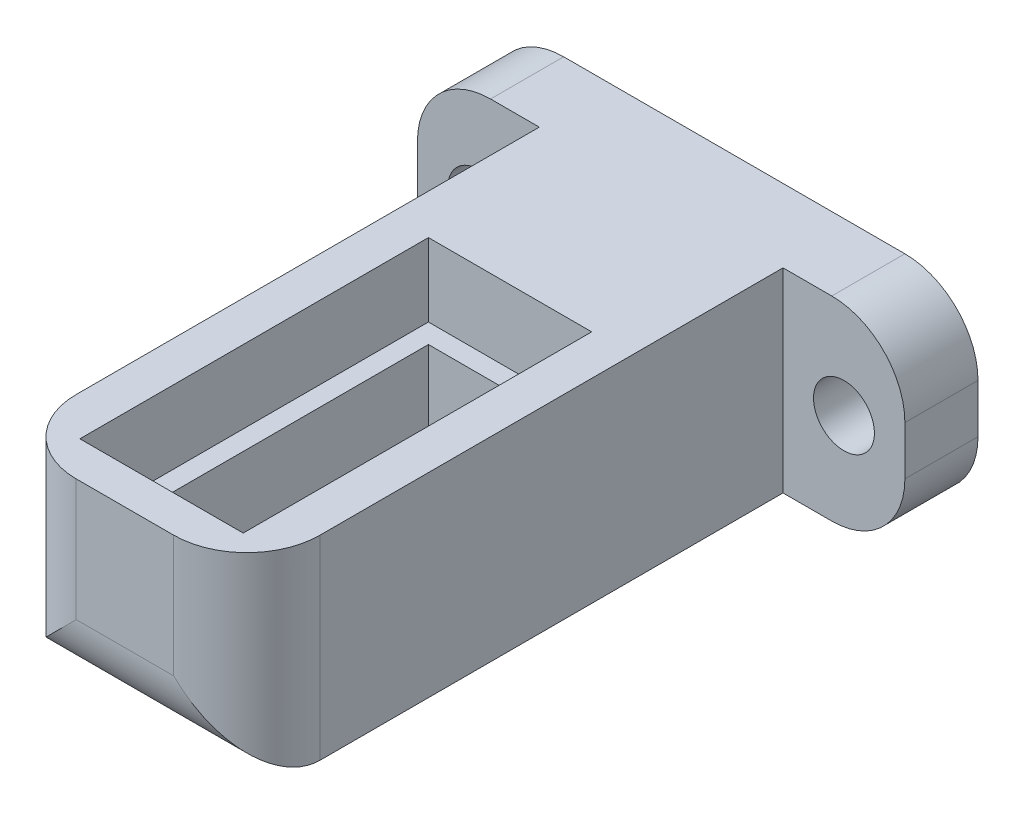
ISO-10303-21;
HEADER;
FILE_DESCRIPTION(('STEP AP214'),'2;1');
FILE_NAME('part.step','',(''),(''),'','','');
FILE_SCHEMA(('AUTOMOTIVE_DESIGN { 1 0 10303 214 1 1 1 1 }'));
ENDSEC;
DATA;
#1=APPLICATION_CONTEXT('core data for automotive mechanical design processes');
#2=APPLICATION_PROTOCOL_DEFINITION('international standard','automotive_design',2000,#1);
#3=PRODUCT_CONTEXT('',#1,'mechanical');
#4=PRODUCT('Part','Part','',(#3));
#5=PRODUCT_RELATED_PRODUCT_CATEGORY('part','',(#4));
#6=PRODUCT_DEFINITION_FORMATION('','',#4);
#7=PRODUCT_DEFINITION_CONTEXT('part definition',#1,'design');
#8=PRODUCT_DEFINITION('design','',#6,#7);
#9=PRODUCT_DEFINITION_SHAPE('','',#8);
#10=(LENGTH_UNIT() NAMED_UNIT(*) SI_UNIT(.MILLI.,.METRE.));
#11=(NAMED_UNIT(*) PLANE_ANGLE_UNIT() SI_UNIT($,.RADIAN.));
#12=(NAMED_UNIT(*) SI_UNIT($,.STERADIAN.) SOLID_ANGLE_UNIT());
#13=UNCERTAINTY_MEASURE_WITH_UNIT(LENGTH_MEASURE(1.E-05),#10,'distance_accuracy_value','');
#14=(GEOMETRIC_REPRESENTATION_CONTEXT(3) GLOBAL_UNCERTAINTY_ASSIGNED_CONTEXT((#13)) GLOBAL_UNIT_ASSIGNED_CONTEXT((#10,
#11,#12)) REPRESENTATION_CONTEXT('',''));
#15=CARTESIAN_POINT('',(0.,0.,0.));
#16=DIRECTION('',(0.,0.,1.));
#17=DIRECTION('',(1.,0.,0.));
#18=AXIS2_PLACEMENT_3D('',#15,#16,#17);
#19=CARTESIAN_POINT('',(-5.,8.,12.5));
#20=DIRECTION('',(1.,0.,0.));
#21=DIRECTION('',(0.,0.,-1.));
#22=AXIS2_PLACEMENT_3D('',#19,#20,#21);
#23=PLANE('',#22);
#24=DIRECTION('',(0.,0.,1.));
#25=VECTOR('',#24,1.);
#26=CARTESIAN_POINT('',(-5.,0.,12.5));
#27=LINE('',#26,#25);
#28=CARTESIAN_POINT('',(-5.,0.,-9.5));
#29=VERTEX_POINT('',#28);
#30=CARTESIAN_POINT('',(-5.,0.,9.5));
#31=VERTEX_POINT('',#30);
#32=EDGE_CURVE('E356',#29,#31,#27,.T.);
#33=ORIENTED_EDGE('',*,*,#32,.T.);
#34=DIRECTION('',(0.,-1.,0.));
#35=VECTOR('',#34,1.);
#36=CARTESIAN_POINT('',(-5.,8.,9.5));
#37=LINE('',#36,#35);
#38=CARTESIAN_POINT('',(-5.,8.,9.5));
#39=VERTEX_POINT('',#38);
#40=EDGE_CURVE('E53',#31,#39,#37,.F.);
#41=ORIENTED_EDGE('',*,*,#40,.T.);
#42=DIRECTION('',(0.,0.,1.));
#43=VECTOR('',#42,1.);
#44=CARTESIAN_POINT('',(-5.,8.,12.5));
#45=LINE('',#44,#43);
#46=CARTESIAN_POINT('',(-5.,8.,-9.5));
#47=VERTEX_POINT('',#46);
#48=EDGE_CURVE('E360',#47,#39,#45,.T.);
#49=ORIENTED_EDGE('',*,*,#48,.F.);
#50=DIRECTION('',(0.,1.,0.));
#51=VECTOR('',#50,1.);
#52=CARTESIAN_POINT('',(-5.,8.,-9.5));
#53=LINE('',#52,#51);
#54=EDGE_CURVE('E261',#29,#47,#53,.T.);
#55=ORIENTED_EDGE('',*,*,#54,.F.);
#56=EDGE_LOOP('',(#33,#41,#49,#55));
#57=FACE_BOUND('',#56,.T.);
#58=ADVANCED_FACE('F43',(#57),#23,.F.);
#59=CARTESIAN_POINT('',(5.,8.,12.5));
#60=DIRECTION('',(-1.,0.,0.));
#61=DIRECTION('',(0.,0.,1.));
#62=AXIS2_PLACEMENT_3D('',#59,#60,#61);
#63=PLANE('',#62);
#64=DIRECTION('',(0.,0.,-1.));
#65=VECTOR('',#64,1.);
#66=CARTESIAN_POINT('',(5.,8.,12.5));
#67=LINE('',#66,#65);
#68=CARTESIAN_POINT('',(5.,8.,9.5));
#69=VERTEX_POINT('',#68);
#70=CARTESIAN_POINT('',(5.,8.,-9.5));
#71=VERTEX_POINT('',#70);
#72=EDGE_CURVE('E352',#69,#71,#67,.T.);
#73=ORIENTED_EDGE('',*,*,#72,.F.);
#74=DIRECTION('',(0.,-1.,0.));
#75=VECTOR('',#74,1.);
#76=CARTESIAN_POINT('',(5.,8.,9.5));
#77=LINE('',#76,#75);
#78=CARTESIAN_POINT('',(5.,0.,9.5));
#79=VERTEX_POINT('',#78);
#80=EDGE_CURVE('E427',#69,#79,#77,.T.);
#81=ORIENTED_EDGE('',*,*,#80,.T.);
#82=DIRECTION('',(0.,0.,-1.));
#83=VECTOR('',#82,1.);
#84=CARTESIAN_POINT('',(5.,0.,12.5));
#85=LINE('',#84,#83);
#86=CARTESIAN_POINT('',(5.,0.,-9.5));
#87=VERTEX_POINT('',#86);
#88=EDGE_CURVE('E342',#79,#87,#85,.T.);
#89=ORIENTED_EDGE('',*,*,#88,.T.);
#90=DIRECTION('',(0.,1.,0.));
#91=VECTOR('',#90,1.);
#92=CARTESIAN_POINT('',(5.,8.,-9.5));
#93=LINE('',#92,#91);
#94=EDGE_CURVE('E288',#87,#71,#93,.T.);
#95=ORIENTED_EDGE('',*,*,#94,.T.);
#96=EDGE_LOOP('',(#73,#81,#89,#95));
#97=FACE_BOUND('',#96,.T.);
#98=ADVANCED_FACE('F480',(#97),#63,.F.);
#99=CARTESIAN_POINT('',(-5.,8.,-12.5));
#100=DIRECTION('',(0.,0.,1.));
#101=DIRECTION('',(1.,0.,0.));
#102=AXIS2_PLACEMENT_3D('',#99,#100,#101);
#103=PLANE('',#102);
#104=CARTESIAN_POINT('',(-7.5,4.,-12.5));
#105=DIRECTION('',(0.,0.,-1.));
#106=DIRECTION('',(-1.,0.,0.));
#107=AXIS2_PLACEMENT_3D('',#104,#105,#106);
#108=CIRCLE('',#107,1.25);
#109=CARTESIAN_POINT('',(-8.75,4.,-12.5));
#110=VERTEX_POINT('',#109);
#111=EDGE_CURVE('E253',#110,#110,#108,.T.);
#112=ORIENTED_EDGE('',*,*,#111,.F.);
#113=EDGE_LOOP('',(#112));
#114=FACE_BOUND('',#113,.T.);
#115=CARTESIAN_POINT('',(7.5,4.,-12.5));
#116=DIRECTION('',(0.,0.,1.));
#117=DIRECTION('',(1.,0.,0.));
#118=AXIS2_PLACEMENT_3D('',#115,#116,#117);
#119=CIRCLE('',#118,1.25);
#120=CARTESIAN_POINT('',(8.75,4.,-12.5));
#121=VERTEX_POINT('',#120);
#122=EDGE_CURVE('E280',#121,#121,#119,.T.);
#123=ORIENTED_EDGE('',*,*,#122,.T.);
#124=EDGE_LOOP('',(#123));
#125=FACE_BOUND('',#124,.T.);
#126=DIRECTION('',(-1.,0.,0.));
#127=VECTOR('',#126,1.);
#128=CARTESIAN_POINT('',(-5.,0.,-12.5));
#129=LINE('',#128,#127);
#130=CARTESIAN_POINT('',(7.,0.,-12.5));
#131=VERTEX_POINT('',#130);
#132=CARTESIAN_POINT('',(-7.,0.,-12.5));
#133=VERTEX_POINT('',#132);
#134=EDGE_CURVE('E370',#131,#133,#129,.T.);
#135=ORIENTED_EDGE('',*,*,#134,.T.);
#136=CARTESIAN_POINT('',(-7.,3.,-12.5));
#137=DIRECTION('',(0.,0.,1.));
#138=DIRECTION('',(1.,0.,0.));
#139=AXIS2_PLACEMENT_3D('',#136,#137,#138);
#140=CIRCLE('',#139,3.);
#141=CARTESIAN_POINT('',(-10.,3.,-12.5));
#142=VERTEX_POINT('',#141);
#143=EDGE_CURVE('E408',#133,#142,#140,.F.);
#144=ORIENTED_EDGE('',*,*,#143,.T.);
#145=DIRECTION('',(0.,-1.,0.));
#146=VECTOR('',#145,1.);
#147=CARTESIAN_POINT('',(-10.,8.,-12.5));
#148=LINE('',#147,#146);
#149=CARTESIAN_POINT('',(-10.,5.,-12.5));
#150=VERTEX_POINT('',#149);
#151=EDGE_CURVE('E257',#150,#142,#148,.T.);
#152=ORIENTED_EDGE('',*,*,#151,.F.);
#153=CARTESIAN_POINT('',(-7.,5.,-12.5));
#154=DIRECTION('',(0.,0.,1.));
#155=DIRECTION('',(1.,0.,0.));
#156=AXIS2_PLACEMENT_3D('',#153,#154,#155);
#157=CIRCLE('',#156,3.);
#158=CARTESIAN_POINT('',(-7.,8.,-12.5));
#159=VERTEX_POINT('',#158);
#160=EDGE_CURVE('E405',#150,#159,#157,.F.);
#161=ORIENTED_EDGE('',*,*,#160,.T.);
#162=DIRECTION('',(-1.,0.,0.));
#163=VECTOR('',#162,1.);
#164=CARTESIAN_POINT('',(-5.,8.,-12.5));
#165=LINE('',#164,#163);
#166=CARTESIAN_POINT('',(7.,8.,-12.5));
#167=VERTEX_POINT('',#166);
#168=EDGE_CURVE('E355',#167,#159,#165,.T.);
#169=ORIENTED_EDGE('',*,*,#168,.F.);
#170=CARTESIAN_POINT('',(7.,5.,-12.5));
#171=DIRECTION('',(0.,0.,1.));
#172=DIRECTION('',(1.,0.,0.));
#173=AXIS2_PLACEMENT_3D('',#170,#171,#172);
#174=CIRCLE('',#173,3.);
#175=CARTESIAN_POINT('',(10.,5.,-12.5));
#176=VERTEX_POINT('',#175);
#177=EDGE_CURVE('E382',#167,#176,#174,.F.);
#178=ORIENTED_EDGE('',*,*,#177,.T.);
#179=DIRECTION('',(0.,-1.,0.));
#180=VECTOR('',#179,1.);
#181=CARTESIAN_POINT('',(10.,8.,-12.5));
#182=LINE('',#181,#180);
#183=CARTESIAN_POINT('',(10.,3.,-12.5));
#184=VERTEX_POINT('',#183);
#185=EDGE_CURVE('E284',#176,#184,#182,.T.);
#186=ORIENTED_EDGE('',*,*,#185,.T.);
#187=CARTESIAN_POINT('',(7.,3.,-12.5));
#188=DIRECTION('',(0.,0.,1.));
#189=DIRECTION('',(1.,0.,0.));
#190=AXIS2_PLACEMENT_3D('',#187,#188,#189);
#191=CIRCLE('',#190,3.);
#192=EDGE_CURVE('E385',#184,#131,#191,.F.);
#193=ORIENTED_EDGE('',*,*,#192,.T.);
#194=EDGE_LOOP('',(#135,#144,#152,#161,#169,#178,#186,#193));
#195=FACE_BOUND('',#194,.T.);
#196=ADVANCED_FACE('F485',(#114,#125,#195),#103,.F.);
#197=CARTESIAN_POINT('',(-5.,8.,12.5));
#198=DIRECTION('',(0.,0.,-1.));
#199=DIRECTION('',(-1.,0.,0.));
#200=AXIS2_PLACEMENT_3D('',#197,#198,#199);
#201=PLANE('',#200);
#202=DIRECTION('',(1.,0.,0.));
#203=VECTOR('',#202,1.);
#204=CARTESIAN_POINT('',(5.,3.,12.5));
#205=LINE('',#204,#203);
#206=CARTESIAN_POINT('',(-2.,3.,12.5));
#207=VERTEX_POINT('',#206);
#208=CARTESIAN_POINT('',(2.,3.,12.5));
#209=VERTEX_POINT('',#208);
#210=EDGE_CURVE('E431',#207,#209,#205,.T.);
#211=ORIENTED_EDGE('',*,*,#210,.T.);
#212=DIRECTION('',(0.,-1.,0.));
#213=VECTOR('',#212,1.);
#214=CARTESIAN_POINT('',(2.,8.,12.5));
#215=LINE('',#214,#213);
#216=CARTESIAN_POINT('',(2.,8.,12.5));
#217=VERTEX_POINT('',#216);
#218=EDGE_CURVE('E437',#209,#217,#215,.F.);
#219=ORIENTED_EDGE('',*,*,#218,.T.);
#220=DIRECTION('',(1.,0.,0.));
#221=VECTOR('',#220,1.);
#222=CARTESIAN_POINT('',(-5.,8.,12.5));
#223=LINE('',#222,#221);
#224=CARTESIAN_POINT('',(-2.,8.,12.5));
#225=VERTEX_POINT('',#224);
#226=EDGE_CURVE('E363',#225,#217,#223,.T.);
#227=ORIENTED_EDGE('',*,*,#226,.F.);
#228=DIRECTION('',(0.,-1.,0.));
#229=VECTOR('',#228,1.);
#230=CARTESIAN_POINT('',(-2.,8.,12.5));
#231=LINE('',#230,#229);
#232=EDGE_CURVE('E434',#225,#207,#231,.T.);
#233=ORIENTED_EDGE('',*,*,#232,.T.);
#234=EDGE_LOOP('',(#211,#219,#227,#233));
#235=FACE_BOUND('',#234,.T.);
#236=ADVANCED_FACE('F490',(#235),#201,.F.);
#237=CARTESIAN_POINT('',(0.,8.,0.));
#238=DIRECTION('',(0.,-1.,0.));
#239=DIRECTION('',(0.,0.,-1.));
#240=AXIS2_PLACEMENT_3D('',#237,#238,#239);
#241=PLANE('',#240);
#242=DIRECTION('',(1.,0.,0.));
#243=VECTOR('',#242,1.);
#244=CARTESIAN_POINT('',(-3.35,8.,11.));
#245=LINE('',#244,#243);
#246=CARTESIAN_POINT('',(-3.35,8.,11.));
#247=VERTEX_POINT('',#246);
#248=CARTESIAN_POINT('',(3.35,8.,11.));
#249=VERTEX_POINT('',#248);
#250=EDGE_CURVE('E328',#247,#249,#245,.T.);
#251=ORIENTED_EDGE('',*,*,#250,.F.);
#252=DIRECTION('',(0.,0.,1.));
#253=VECTOR('',#252,1.);
#254=CARTESIAN_POINT('',(-3.35,8.,-3.3));
#255=LINE('',#254,#253);
#256=CARTESIAN_POINT('',(-3.35,8.,-3.3));
#257=VERTEX_POINT('',#256);
#258=EDGE_CURVE('E304',#257,#247,#255,.T.);
#259=ORIENTED_EDGE('',*,*,#258,.F.);
#260=DIRECTION('',(-1.,0.,0.));
#261=VECTOR('',#260,1.);
#262=CARTESIAN_POINT('',(-3.35,8.,-3.3));
#263=LINE('',#262,#261);
#264=CARTESIAN_POINT('',(3.35,8.,-3.3));
#265=VERTEX_POINT('',#264);
#266=EDGE_CURVE('E313',#265,#257,#263,.T.);
#267=ORIENTED_EDGE('',*,*,#266,.F.);
#268=DIRECTION('',(0.,0.,-1.));
#269=VECTOR('',#268,1.);
#270=CARTESIAN_POINT('',(3.35,8.,-3.3));
#271=LINE('',#270,#269);
#272=EDGE_CURVE('E332',#249,#265,#271,.T.);
#273=ORIENTED_EDGE('',*,*,#272,.F.);
#274=EDGE_LOOP('',(#251,#259,#267,#273));
#275=FACE_BOUND('',#274,.T.);
#276=ORIENTED_EDGE('',*,*,#226,.T.);
#277=CARTESIAN_POINT('',(2.,8.,9.5));
#278=DIRECTION('',(0.,-1.,0.));
#279=DIRECTION('',(0.,0.,-1.));
#280=AXIS2_PLACEMENT_3D('',#277,#278,#279);
#281=CIRCLE('',#280,3.);
#282=EDGE_CURVE('E443',#217,#69,#281,.F.);
#283=ORIENTED_EDGE('',*,*,#282,.T.);
#284=ORIENTED_EDGE('',*,*,#72,.T.);
#285=DIRECTION('',(1.,0.,0.));
#286=VECTOR('',#285,1.);
#287=CARTESIAN_POINT('',(5.,8.,-9.5));
#288=LINE('',#287,#286);
#289=CARTESIAN_POINT('',(7.,8.,-9.5));
#290=VERTEX_POINT('',#289);
#291=EDGE_CURVE('E292',#71,#290,#288,.T.);
#292=ORIENTED_EDGE('',*,*,#291,.T.);
#293=DIRECTION('',(0.,0.,-1.));
#294=VECTOR('',#293,1.);
#295=CARTESIAN_POINT('',(7.,8.,-12.5));
#296=LINE('',#295,#294);
#297=EDGE_CURVE('E397',#290,#167,#296,.T.);
#298=ORIENTED_EDGE('',*,*,#297,.T.);
#299=ORIENTED_EDGE('',*,*,#168,.T.);
#300=DIRECTION('',(0.,0.,-1.));
#301=VECTOR('',#300,1.);
#302=CARTESIAN_POINT('',(-7.,8.,0.));
#303=LINE('',#302,#301);
#304=CARTESIAN_POINT('',(-7.,8.,-9.5));
#305=VERTEX_POINT('',#304);
#306=EDGE_CURVE('E424',#159,#305,#303,.F.);
#307=ORIENTED_EDGE('',*,*,#306,.T.);
#308=DIRECTION('',(-1.,0.,0.));
#309=VECTOR('',#308,1.);
#310=CARTESIAN_POINT('',(-5.,8.,-9.5));
#311=LINE('',#310,#309);
#312=EDGE_CURVE('E272',#47,#305,#311,.T.);
#313=ORIENTED_EDGE('',*,*,#312,.F.);
#314=ORIENTED_EDGE('',*,*,#48,.T.);
#315=CARTESIAN_POINT('',(-2.,8.,9.5));
#316=DIRECTION('',(0.,-1.,0.));
#317=DIRECTION('',(0.,0.,-1.));
#318=AXIS2_PLACEMENT_3D('',#315,#316,#317);
#319=CIRCLE('',#318,3.);
#320=EDGE_CURVE('E440',#39,#225,#319,.F.);
#321=ORIENTED_EDGE('',*,*,#320,.T.);
#322=EDGE_LOOP('',(#276,#283,#284,#292,#298,#299,#307,#313,#314,#321));
#323=FACE_BOUND('',#322,.T.);
#324=ADVANCED_FACE('F650',(#275,#323),#241,.F.);
#325=CARTESIAN_POINT('',(0.,0.,0.));
#326=DIRECTION('',(0.,-1.,0.));
#327=DIRECTION('',(0.,0.,-1.));
#328=AXIS2_PLACEMENT_3D('',#325,#326,#327);
#329=PLANE('',#328);
#330=CARTESIAN_POINT('',(0.,0.,0.499999999999998));
#331=DIRECTION('',(0.,1.,0.));
#332=DIRECTION('',(0.,0.,1.));
#333=AXIS2_PLACEMENT_3D('',#330,#331,#332);
#334=CIRCLE('',#333,2.);
#335=CARTESIAN_POINT('',(0.,0.,2.5));
#336=VERTEX_POINT('',#335);
#337=EDGE_CURVE('E238',#336,#336,#334,.T.);
#338=ORIENTED_EDGE('',*,*,#337,.T.);
#339=EDGE_LOOP('',(#338));
#340=FACE_BOUND('',#339,.T.);
#341=ORIENTED_EDGE('',*,*,#88,.F.);
#342=DIRECTION('',(1.,0.,0.));
#343=VECTOR('',#342,1.);
#344=CARTESIAN_POINT('',(-5.,0.,9.5));
#345=LINE('',#344,#343);
#346=EDGE_CURVE('E11',#79,#31,#345,.F.);
#347=ORIENTED_EDGE('',*,*,#346,.T.);
#348=ORIENTED_EDGE('',*,*,#32,.F.);
#349=DIRECTION('',(1.,0.,0.));
#350=VECTOR('',#349,1.);
#351=CARTESIAN_POINT('',(-5.,0.,-9.5));
#352=LINE('',#351,#350);
#353=CARTESIAN_POINT('',(-7.,0.,-9.5));
#354=VERTEX_POINT('',#353);
#355=EDGE_CURVE('E265',#354,#29,#352,.T.);
#356=ORIENTED_EDGE('',*,*,#355,.F.);
#357=DIRECTION('',(0.,0.,-1.));
#358=VECTOR('',#357,1.);
#359=CARTESIAN_POINT('',(-7.,0.,-12.5));
#360=LINE('',#359,#358);
#361=EDGE_CURVE('E401',#354,#133,#360,.T.);
#362=ORIENTED_EDGE('',*,*,#361,.T.);
#363=ORIENTED_EDGE('',*,*,#134,.F.);
#364=DIRECTION('',(0.,0.,-1.));
#365=VECTOR('',#364,1.);
#366=CARTESIAN_POINT('',(7.,0.,0.));
#367=LINE('',#366,#365);
#368=CARTESIAN_POINT('',(7.,0.,-9.5));
#369=VERTEX_POINT('',#368);
#370=EDGE_CURVE('E388',#131,#369,#367,.F.);
#371=ORIENTED_EDGE('',*,*,#370,.T.);
#372=DIRECTION('',(-1.,0.,0.));
#373=VECTOR('',#372,1.);
#374=CARTESIAN_POINT('',(5.,0.,-9.5));
#375=LINE('',#374,#373);
#376=EDGE_CURVE('E300',#369,#87,#375,.T.);
#377=ORIENTED_EDGE('',*,*,#376,.T.);
#378=EDGE_LOOP('',(#341,#347,#348,#356,#362,#363,#371,#377));
#379=FACE_BOUND('',#378,.T.);
#380=ADVANCED_FACE('F466',(#340,#379),#329,.T.);
#381=CARTESIAN_POINT('',(-3.35,5.,-3.3));
#382=DIRECTION('',(-1.,0.,0.));
#383=DIRECTION('',(0.,0.,1.));
#384=AXIS2_PLACEMENT_3D('',#381,#382,#383);
#385=PLANE('',#384);
#386=ORIENTED_EDGE('',*,*,#258,.T.);
#387=DIRECTION('',(0.,1.,0.));
#388=VECTOR('',#387,1.);
#389=CARTESIAN_POINT('',(-3.35,5.,11.));
#390=LINE('',#389,#388);
#391=CARTESIAN_POINT('',(-3.35,5.,11.));
#392=VERTEX_POINT('',#391);
#393=EDGE_CURVE('E325',#392,#247,#390,.T.);
#394=ORIENTED_EDGE('',*,*,#393,.F.);
#395=DIRECTION('',(0.,0.,1.));
#396=VECTOR('',#395,1.);
#397=CARTESIAN_POINT('',(-3.35,5.,-3.3));
#398=LINE('',#397,#396);
#399=CARTESIAN_POINT('',(-3.35,5.,-3.3));
#400=VERTEX_POINT('',#399);
#401=EDGE_CURVE('E308',#400,#392,#398,.T.);
#402=ORIENTED_EDGE('',*,*,#401,.F.);
#403=DIRECTION('',(0.,1.,0.));
#404=VECTOR('',#403,1.);
#405=CARTESIAN_POINT('',(-3.35,5.,-3.3));
#406=LINE('',#405,#404);
#407=EDGE_CURVE('E339',#400,#257,#406,.T.);
#408=ORIENTED_EDGE('',*,*,#407,.T.);
#409=EDGE_LOOP('',(#386,#394,#402,#408));
#410=FACE_BOUND('',#409,.T.);
#411=ADVANCED_FACE('F649',(#410),#385,.F.);
#412=CARTESIAN_POINT('',(-3.35,5.,-3.3));
#413=DIRECTION('',(0.,0.,-1.));
#414=DIRECTION('',(-1.,0.,0.));
#415=AXIS2_PLACEMENT_3D('',#412,#413,#414);
#416=PLANE('',#415);
#417=ORIENTED_EDGE('',*,*,#266,.T.);
#418=ORIENTED_EDGE('',*,*,#407,.F.);
#419=DIRECTION('',(-1.,0.,0.));
#420=VECTOR('',#419,1.);
#421=CARTESIAN_POINT('',(-3.35,5.,-3.3));
#422=LINE('',#421,#420);
#423=CARTESIAN_POINT('',(3.35,5.,-3.3));
#424=VERTEX_POINT('',#423);
#425=EDGE_CURVE('E321',#424,#400,#422,.T.);
#426=ORIENTED_EDGE('',*,*,#425,.F.);
#427=DIRECTION('',(0.,1.,0.));
#428=VECTOR('',#427,1.);
#429=CARTESIAN_POINT('',(3.35,5.,-3.3));
#430=LINE('',#429,#428);
#431=EDGE_CURVE('E343',#424,#265,#430,.T.);
#432=ORIENTED_EDGE('',*,*,#431,.T.);
#433=EDGE_LOOP('',(#417,#418,#426,#432));
#434=FACE_BOUND('',#433,.T.);
#435=ADVANCED_FACE('F761',(#434),#416,.F.);
#436=CARTESIAN_POINT('',(3.35,5.,-3.3));
#437=DIRECTION('',(1.,0.,0.));
#438=DIRECTION('',(0.,0.,-1.));
#439=AXIS2_PLACEMENT_3D('',#436,#437,#438);
#440=PLANE('',#439);
#441=ORIENTED_EDGE('',*,*,#272,.T.);
#442=ORIENTED_EDGE('',*,*,#431,.F.);
#443=DIRECTION('',(0.,0.,-1.));
#444=VECTOR('',#443,1.);
#445=CARTESIAN_POINT('',(3.35,5.,-3.3));
#446=LINE('',#445,#444);
#447=CARTESIAN_POINT('',(3.35,5.,11.));
#448=VERTEX_POINT('',#447);
#449=EDGE_CURVE('E317',#448,#424,#446,.T.);
#450=ORIENTED_EDGE('',*,*,#449,.F.);
#451=DIRECTION('',(0.,1.,0.));
#452=VECTOR('',#451,1.);
#453=CARTESIAN_POINT('',(3.35,5.,11.));
#454=LINE('',#453,#452);
#455=EDGE_CURVE('E346',#448,#249,#454,.T.);
#456=ORIENTED_EDGE('',*,*,#455,.T.);
#457=EDGE_LOOP('',(#441,#442,#450,#456));
#458=FACE_BOUND('',#457,.T.);
#459=ADVANCED_FACE('F753',(#458),#440,.F.);
#460=CARTESIAN_POINT('',(-3.35,5.,11.));
#461=DIRECTION('',(0.,0.,1.));
#462=DIRECTION('',(1.,0.,0.));
#463=AXIS2_PLACEMENT_3D('',#460,#461,#462);
#464=PLANE('',#463);
#465=ORIENTED_EDGE('',*,*,#250,.T.);
#466=ORIENTED_EDGE('',*,*,#455,.F.);
#467=DIRECTION('',(1.,0.,0.));
#468=VECTOR('',#467,1.);
#469=CARTESIAN_POINT('',(-3.35,5.,11.));
#470=LINE('',#469,#468);
#471=EDGE_CURVE('E312',#392,#448,#470,.T.);
#472=ORIENTED_EDGE('',*,*,#471,.F.);
#473=ORIENTED_EDGE('',*,*,#393,.T.);
#474=EDGE_LOOP('',(#465,#466,#472,#473));
#475=FACE_BOUND('',#474,.T.);
#476=ADVANCED_FACE('F747',(#475),#464,.F.);
#477=CARTESIAN_POINT('',(0.,5.,0.));
#478=DIRECTION('',(0.,1.,0.));
#479=DIRECTION('',(0.,0.,1.));
#480=AXIS2_PLACEMENT_3D('',#477,#478,#479);
#481=PLANE('',#480);
#482=DIRECTION('',(-1.,0.,0.));
#483=VECTOR('',#482,1.);
#484=CARTESIAN_POINT('',(2.55,5.,-2.5));
#485=LINE('',#484,#483);
#486=CARTESIAN_POINT('',(2.55,5.,-2.5));
#487=VERTEX_POINT('',#486);
#488=CARTESIAN_POINT('',(-2.55,5.,-2.5));
#489=VERTEX_POINT('',#488);
#490=EDGE_CURVE('E201',#487,#489,#485,.T.);
#491=ORIENTED_EDGE('',*,*,#490,.F.);
#492=DIRECTION('',(0.,0.,-1.));
#493=VECTOR('',#492,1.);
#494=CARTESIAN_POINT('',(2.55,5.,10.2));
#495=LINE('',#494,#493);
#496=CARTESIAN_POINT('',(2.55,5.,10.2));
#497=VERTEX_POINT('',#496);
#498=EDGE_CURVE('E221',#497,#487,#495,.T.);
#499=ORIENTED_EDGE('',*,*,#498,.F.);
#500=DIRECTION('',(1.,0.,0.));
#501=VECTOR('',#500,1.);
#502=CARTESIAN_POINT('',(-2.55,5.,10.2));
#503=LINE('',#502,#501);
#504=CARTESIAN_POINT('',(-2.55,5.,10.2));
#505=VERTEX_POINT('',#504);
#506=EDGE_CURVE('E225',#505,#497,#503,.T.);
#507=ORIENTED_EDGE('',*,*,#506,.F.);
#508=DIRECTION('',(0.,0.,1.));
#509=VECTOR('',#508,1.);
#510=CARTESIAN_POINT('',(-2.55,5.,-2.5));
#511=LINE('',#510,#509);
#512=EDGE_CURVE('E237',#489,#505,#511,.T.);
#513=ORIENTED_EDGE('',*,*,#512,.F.);
#514=EDGE_LOOP('',(#491,#499,#507,#513));
#515=FACE_BOUND('',#514,.T.);
#516=ORIENTED_EDGE('',*,*,#401,.T.);
#517=ORIENTED_EDGE('',*,*,#471,.T.);
#518=ORIENTED_EDGE('',*,*,#449,.T.);
#519=ORIENTED_EDGE('',*,*,#425,.T.);
#520=EDGE_LOOP('',(#516,#517,#518,#519));
#521=FACE_BOUND('',#520,.T.);
#522=ADVANCED_FACE('F723',(#515,#521),#481,.T.);
#523=CARTESIAN_POINT('',(10.,8.,-9.5));
#524=DIRECTION('',(1.,0.,0.));
#525=DIRECTION('',(0.,1.,0.));
#526=AXIS2_PLACEMENT_3D('',#523,#524,#525);
#527=PLANE('',#526);
#528=DIRECTION('',(0.,-1.,0.));
#529=VECTOR('',#528,1.);
#530=CARTESIAN_POINT('',(10.,8.,-9.5));
#531=LINE('',#530,#529);
#532=CARTESIAN_POINT('',(10.,5.,-9.5));
#533=VERTEX_POINT('',#532);
#534=CARTESIAN_POINT('',(10.,3.,-9.5));
#535=VERTEX_POINT('',#534);
#536=EDGE_CURVE('E296',#533,#535,#531,.T.);
#537=ORIENTED_EDGE('',*,*,#536,.T.);
#538=DIRECTION('',(0.,0.,-1.));
#539=VECTOR('',#538,1.);
#540=CARTESIAN_POINT('',(10.,3.,-9.5));
#541=LINE('',#540,#539);
#542=EDGE_CURVE('E378',#535,#184,#541,.T.);
#543=ORIENTED_EDGE('',*,*,#542,.T.);
#544=ORIENTED_EDGE('',*,*,#185,.F.);
#545=DIRECTION('',(0.,0.,-1.));
#546=VECTOR('',#545,1.);
#547=CARTESIAN_POINT('',(10.,5.,-9.5));
#548=LINE('',#547,#546);
#549=EDGE_CURVE('E367',#176,#533,#548,.F.);
#550=ORIENTED_EDGE('',*,*,#549,.T.);
#551=EDGE_LOOP('',(#537,#543,#544,#550));
#552=FACE_BOUND('',#551,.T.);
#553=ADVANCED_FACE('F714',(#552),#527,.T.);
#554=CARTESIAN_POINT('',(0.,0.,-9.5));
#555=DIRECTION('',(0.,0.,1.));
#556=DIRECTION('',(1.,0.,0.));
#557=AXIS2_PLACEMENT_3D('',#554,#555,#556);
#558=PLANE('',#557);
#559=CARTESIAN_POINT('',(7.5,4.,-9.5));
#560=DIRECTION('',(0.,0.,1.));
#561=DIRECTION('',(1.,0.,0.));
#562=AXIS2_PLACEMENT_3D('',#559,#560,#561);
#563=CIRCLE('',#562,1.25);
#564=CARTESIAN_POINT('',(8.75,4.,-9.5));
#565=VERTEX_POINT('',#564);
#566=EDGE_CURVE('E276',#565,#565,#563,.T.);
#567=ORIENTED_EDGE('',*,*,#566,.F.);
#568=EDGE_LOOP('',(#567));
#569=FACE_BOUND('',#568,.T.);
#570=ORIENTED_EDGE('',*,*,#376,.F.);
#571=CARTESIAN_POINT('',(7.,3.,-9.5));
#572=DIRECTION('',(0.,0.,1.));
#573=DIRECTION('',(1.,0.,0.));
#574=AXIS2_PLACEMENT_3D('',#571,#572,#573);
#575=CIRCLE('',#574,3.);
#576=EDGE_CURVE('E394',#369,#535,#575,.T.);
#577=ORIENTED_EDGE('',*,*,#576,.T.);
#578=ORIENTED_EDGE('',*,*,#536,.F.);
#579=CARTESIAN_POINT('',(7.,5.,-9.5));
#580=DIRECTION('',(0.,0.,1.));
#581=DIRECTION('',(1.,0.,0.));
#582=AXIS2_PLACEMENT_3D('',#579,#580,#581);
#583=CIRCLE('',#582,3.);
#584=EDGE_CURVE('E391',#533,#290,#583,.T.);
#585=ORIENTED_EDGE('',*,*,#584,.T.);
#586=ORIENTED_EDGE('',*,*,#291,.F.);
#587=ORIENTED_EDGE('',*,*,#94,.F.);
#588=EDGE_LOOP('',(#570,#577,#578,#585,#586,#587));
#589=FACE_BOUND('',#588,.T.);
#590=ADVANCED_FACE('F703',(#569,#589),#558,.T.);
#591=CARTESIAN_POINT('',(7.5,4.,-12.5));
#592=DIRECTION('',(0.,0.,1.));
#593=DIRECTION('',(1.,0.,0.));
#594=AXIS2_PLACEMENT_3D('',#591,#592,#593);
#595=CYLINDRICAL_SURFACE('',#594,1.25);
#596=ORIENTED_EDGE('',*,*,#122,.F.);
#597=EDGE_LOOP('',(#596));
#598=FACE_BOUND('',#597,.T.);
#599=ORIENTED_EDGE('',*,*,#566,.T.);
#600=EDGE_LOOP('',(#599));
#601=FACE_BOUND('',#600,.T.);
#602=ADVANCED_FACE('F499',(#598,#601),#595,.F.);
#603=CARTESIAN_POINT('',(7.,3.,-9.5));
#604=DIRECTION('',(0.,0.,-1.));
#605=DIRECTION('',(-1.,0.,0.));
#606=AXIS2_PLACEMENT_3D('',#603,#604,#605);
#607=CYLINDRICAL_SURFACE('',#606,3.);
#608=ORIENTED_EDGE('',*,*,#576,.F.);
#609=ORIENTED_EDGE('',*,*,#370,.F.);
#610=ORIENTED_EDGE('',*,*,#192,.F.);
#611=ORIENTED_EDGE('',*,*,#542,.F.);
#612=EDGE_LOOP('',(#608,#609,#610,#611));
#613=FACE_BOUND('',#612,.T.);
#614=ADVANCED_FACE('F495',(#613),#607,.T.);
#615=CARTESIAN_POINT('',(7.,5.,0.));
#616=DIRECTION('',(0.,0.,1.));
#617=DIRECTION('',(1.,0.,0.));
#618=AXIS2_PLACEMENT_3D('',#615,#616,#617);
#619=CYLINDRICAL_SURFACE('',#618,3.);
#620=ORIENTED_EDGE('',*,*,#584,.F.);
#621=ORIENTED_EDGE('',*,*,#549,.F.);
#622=ORIENTED_EDGE('',*,*,#177,.F.);
#623=ORIENTED_EDGE('',*,*,#297,.F.);
#624=EDGE_LOOP('',(#620,#621,#622,#623));
#625=FACE_BOUND('',#624,.T.);
#626=ADVANCED_FACE('F498',(#625),#619,.T.);
#627=CARTESIAN_POINT('',(-10.,8.,-9.5));
#628=DIRECTION('',(1.,0.,0.));
#629=DIRECTION('',(0.,1.,0.));
#630=AXIS2_PLACEMENT_3D('',#627,#628,#629);
#631=PLANE('',#630);
#632=ORIENTED_EDGE('',*,*,#151,.T.);
#633=DIRECTION('',(0.,0.,-1.));
#634=VECTOR('',#633,1.);
#635=CARTESIAN_POINT('',(-10.,3.,-9.5));
#636=LINE('',#635,#634);
#637=CARTESIAN_POINT('',(-10.,3.,-9.5));
#638=VERTEX_POINT('',#637);
#639=EDGE_CURVE('E415',#142,#638,#636,.F.);
#640=ORIENTED_EDGE('',*,*,#639,.T.);
#641=DIRECTION('',(0.,-1.,0.));
#642=VECTOR('',#641,1.);
#643=CARTESIAN_POINT('',(-10.,8.,-9.5));
#644=LINE('',#643,#642);
#645=CARTESIAN_POINT('',(-10.,5.,-9.5));
#646=VERTEX_POINT('',#645);
#647=EDGE_CURVE('E268',#646,#638,#644,.T.);
#648=ORIENTED_EDGE('',*,*,#647,.F.);
#649=DIRECTION('',(0.,0.,-1.));
#650=VECTOR('',#649,1.);
#651=CARTESIAN_POINT('',(-10.,5.,-9.5));
#652=LINE('',#651,#650);
#653=EDGE_CURVE('E411',#646,#150,#652,.T.);
#654=ORIENTED_EDGE('',*,*,#653,.T.);
#655=EDGE_LOOP('',(#632,#640,#648,#654));
#656=FACE_BOUND('',#655,.T.);
#657=ADVANCED_FACE('F503',(#656),#631,.F.);
#658=CARTESIAN_POINT('',(0.,0.,-9.5));
#659=DIRECTION('',(0.,0.,1.));
#660=DIRECTION('',(-1.,0.,0.));
#661=AXIS2_PLACEMENT_3D('',#658,#659,#660);
#662=PLANE('',#661);
#663=CARTESIAN_POINT('',(-7.5,4.,-9.5));
#664=DIRECTION('',(0.,0.,-1.));
#665=DIRECTION('',(-1.,0.,0.));
#666=AXIS2_PLACEMENT_3D('',#663,#664,#665);
#667=CIRCLE('',#666,1.25);
#668=CARTESIAN_POINT('',(-8.75,4.,-9.5));
#669=VERTEX_POINT('',#668);
#670=EDGE_CURVE('E246',#669,#669,#667,.T.);
#671=ORIENTED_EDGE('',*,*,#670,.T.);
#672=EDGE_LOOP('',(#671));
#673=FACE_BOUND('',#672,.T.);
#674=ORIENTED_EDGE('',*,*,#647,.T.);
#675=CARTESIAN_POINT('',(-7.,3.,-9.5));
#676=DIRECTION('',(0.,0.,1.));
#677=DIRECTION('',(1.,0.,0.));
#678=AXIS2_PLACEMENT_3D('',#675,#676,#677);
#679=CIRCLE('',#678,3.);
#680=EDGE_CURVE('E421',#638,#354,#679,.T.);
#681=ORIENTED_EDGE('',*,*,#680,.T.);
#682=ORIENTED_EDGE('',*,*,#355,.T.);
#683=ORIENTED_EDGE('',*,*,#54,.T.);
#684=ORIENTED_EDGE('',*,*,#312,.T.);
#685=CARTESIAN_POINT('',(-7.,5.,-9.5));
#686=DIRECTION('',(0.,0.,1.));
#687=DIRECTION('',(1.,0.,0.));
#688=AXIS2_PLACEMENT_3D('',#685,#686,#687);
#689=CIRCLE('',#688,3.);
#690=EDGE_CURVE('E418',#305,#646,#689,.T.);
#691=ORIENTED_EDGE('',*,*,#690,.T.);
#692=EDGE_LOOP('',(#674,#681,#682,#683,#684,#691));
#693=FACE_BOUND('',#692,.T.);
#694=ADVANCED_FACE('F617',(#673,#693),#662,.T.);
#695=CARTESIAN_POINT('',(-7.5,4.,-12.5));
#696=DIRECTION('',(0.,0.,1.));
#697=DIRECTION('',(1.,0.,0.));
#698=AXIS2_PLACEMENT_3D('',#695,#696,#697);
#699=CYLINDRICAL_SURFACE('',#698,1.25);
#700=ORIENTED_EDGE('',*,*,#111,.T.);
#701=EDGE_LOOP('',(#700));
#702=FACE_BOUND('',#701,.T.);
#703=ORIENTED_EDGE('',*,*,#670,.F.);
#704=EDGE_LOOP('',(#703));
#705=FACE_BOUND('',#704,.T.);
#706=ADVANCED_FACE('F509',(#702,#705),#699,.F.);
#707=CARTESIAN_POINT('',(-7.,3.,0.));
#708=DIRECTION('',(0.,0.,1.));
#709=DIRECTION('',(1.,0.,0.));
#710=AXIS2_PLACEMENT_3D('',#707,#708,#709);
#711=CYLINDRICAL_SURFACE('',#710,3.);
#712=ORIENTED_EDGE('',*,*,#680,.F.);
#713=ORIENTED_EDGE('',*,*,#639,.F.);
#714=ORIENTED_EDGE('',*,*,#143,.F.);
#715=ORIENTED_EDGE('',*,*,#361,.F.);
#716=EDGE_LOOP('',(#712,#713,#714,#715));
#717=FACE_BOUND('',#716,.T.);
#718=ADVANCED_FACE('F505',(#717),#711,.T.);
#719=CARTESIAN_POINT('',(-7.,5.,-9.5));
#720=DIRECTION('',(0.,0.,-1.));
#721=DIRECTION('',(-1.,0.,0.));
#722=AXIS2_PLACEMENT_3D('',#719,#720,#721);
#723=CYLINDRICAL_SURFACE('',#722,3.);
#724=ORIENTED_EDGE('',*,*,#690,.F.);
#725=ORIENTED_EDGE('',*,*,#306,.F.);
#726=ORIENTED_EDGE('',*,*,#160,.F.);
#727=ORIENTED_EDGE('',*,*,#653,.F.);
#728=EDGE_LOOP('',(#724,#725,#726,#727));
#729=FACE_BOUND('',#728,.T.);
#730=ADVANCED_FACE('F508',(#729),#723,.T.);
#731=CARTESIAN_POINT('',(2.55,2.,-2.5));
#732=DIRECTION('',(0.,0.,-1.));
#733=DIRECTION('',(-1.,0.,0.));
#734=AXIS2_PLACEMENT_3D('',#731,#732,#733);
#735=PLANE('',#734);
#736=ORIENTED_EDGE('',*,*,#490,.T.);
#737=DIRECTION('',(0.,1.,0.));
#738=VECTOR('',#737,1.);
#739=CARTESIAN_POINT('',(-2.55,2.,-2.5));
#740=LINE('',#739,#738);
#741=CARTESIAN_POINT('',(-2.55,2.,-2.5));
#742=VERTEX_POINT('',#741);
#743=EDGE_CURVE('E194',#742,#489,#740,.T.);
#744=ORIENTED_EDGE('',*,*,#743,.F.);
#745=DIRECTION('',(-1.,0.,0.));
#746=VECTOR('',#745,1.);
#747=CARTESIAN_POINT('',(2.55,2.,-2.5));
#748=LINE('',#747,#746);
#749=CARTESIAN_POINT('',(2.55,2.,-2.5));
#750=VERTEX_POINT('',#749);
#751=EDGE_CURVE('E198',#750,#742,#748,.T.);
#752=ORIENTED_EDGE('',*,*,#751,.F.);
#753=DIRECTION('',(0.,1.,0.));
#754=VECTOR('',#753,1.);
#755=CARTESIAN_POINT('',(2.55,2.,-2.5));
#756=LINE('',#755,#754);
#757=EDGE_CURVE('E243',#750,#487,#756,.T.);
#758=ORIENTED_EDGE('',*,*,#757,.T.);
#759=EDGE_LOOP('',(#736,#744,#752,#758));
#760=FACE_BOUND('',#759,.T.);
#761=ADVANCED_FACE('F196',(#760),#735,.F.);
#762=CARTESIAN_POINT('',(2.55,2.,10.2));
#763=DIRECTION('',(1.,0.,0.));
#764=DIRECTION('',(0.,0.,-1.));
#765=AXIS2_PLACEMENT_3D('',#762,#763,#764);
#766=PLANE('',#765);
#767=ORIENTED_EDGE('',*,*,#498,.T.);
#768=ORIENTED_EDGE('',*,*,#757,.F.);
#769=DIRECTION('',(0.,0.,-1.));
#770=VECTOR('',#769,1.);
#771=CARTESIAN_POINT('',(2.55,2.,10.2));
#772=LINE('',#771,#770);
#773=CARTESIAN_POINT('',(2.55,2.,10.2));
#774=VERTEX_POINT('',#773);
#775=EDGE_CURVE('E207',#774,#750,#772,.T.);
#776=ORIENTED_EDGE('',*,*,#775,.F.);
#777=DIRECTION('',(0.,1.,0.));
#778=VECTOR('',#777,1.);
#779=CARTESIAN_POINT('',(2.55,2.,10.2));
#780=LINE('',#779,#778);
#781=EDGE_CURVE('E247',#774,#497,#780,.T.);
#782=ORIENTED_EDGE('',*,*,#781,.T.);
#783=EDGE_LOOP('',(#767,#768,#776,#782));
#784=FACE_BOUND('',#783,.T.);
#785=ADVANCED_FACE('F572',(#784),#766,.F.);
#786=CARTESIAN_POINT('',(-2.55,2.,10.2));
#787=DIRECTION('',(0.,0.,1.));
#788=DIRECTION('',(1.,0.,0.));
#789=AXIS2_PLACEMENT_3D('',#786,#787,#788);
#790=PLANE('',#789);
#791=ORIENTED_EDGE('',*,*,#506,.T.);
#792=ORIENTED_EDGE('',*,*,#781,.F.);
#793=DIRECTION('',(1.,0.,0.));
#794=VECTOR('',#793,1.);
#795=CARTESIAN_POINT('',(-2.55,2.,10.2));
#796=LINE('',#795,#794);
#797=CARTESIAN_POINT('',(-2.55,2.,10.2));
#798=VERTEX_POINT('',#797);
#799=EDGE_CURVE('E216',#798,#774,#796,.T.);
#800=ORIENTED_EDGE('',*,*,#799,.F.);
#801=DIRECTION('',(0.,1.,0.));
#802=VECTOR('',#801,1.);
#803=CARTESIAN_POINT('',(-2.55,2.,10.2));
#804=LINE('',#803,#802);
#805=EDGE_CURVE('E206',#798,#505,#804,.T.);
#806=ORIENTED_EDGE('',*,*,#805,.T.);
#807=EDGE_LOOP('',(#791,#792,#800,#806));
#808=FACE_BOUND('',#807,.T.);
#809=ADVANCED_FACE('F562',(#808),#790,.F.);
#810=CARTESIAN_POINT('',(-2.55,2.,-2.5));
#811=DIRECTION('',(-1.,0.,0.));
#812=DIRECTION('',(0.,0.,1.));
#813=AXIS2_PLACEMENT_3D('',#810,#811,#812);
#814=PLANE('',#813);
#815=ORIENTED_EDGE('',*,*,#512,.T.);
#816=ORIENTED_EDGE('',*,*,#805,.F.);
#817=DIRECTION('',(0.,0.,1.));
#818=VECTOR('',#817,1.);
#819=CARTESIAN_POINT('',(-2.55,2.,-2.5));
#820=LINE('',#819,#818);
#821=EDGE_CURVE('E210',#742,#798,#820,.T.);
#822=ORIENTED_EDGE('',*,*,#821,.F.);
#823=ORIENTED_EDGE('',*,*,#743,.T.);
#824=EDGE_LOOP('',(#815,#816,#822,#823));
#825=FACE_BOUND('',#824,.T.);
#826=ADVANCED_FACE('F211',(#825),#814,.F.);
#827=CARTESIAN_POINT('',(0.,2.,0.));
#828=DIRECTION('',(0.,1.,0.));
#829=DIRECTION('',(0.,0.,1.));
#830=AXIS2_PLACEMENT_3D('',#827,#828,#829);
#831=PLANE('',#830);
#832=CARTESIAN_POINT('',(0.,2.,0.499999999999998));
#833=DIRECTION('',(0.,1.,0.));
#834=DIRECTION('',(0.,0.,1.));
#835=AXIS2_PLACEMENT_3D('',#832,#833,#834);
#836=CIRCLE('',#835,2.);
#837=CARTESIAN_POINT('',(0.,2.,2.5));
#838=VERTEX_POINT('',#837);
#839=EDGE_CURVE('E228',#838,#838,#836,.T.);
#840=ORIENTED_EDGE('',*,*,#839,.F.);
#841=EDGE_LOOP('',(#840));
#842=FACE_BOUND('',#841,.T.);
#843=ORIENTED_EDGE('',*,*,#751,.T.);
#844=ORIENTED_EDGE('',*,*,#821,.T.);
#845=ORIENTED_EDGE('',*,*,#799,.T.);
#846=ORIENTED_EDGE('',*,*,#775,.T.);
#847=EDGE_LOOP('',(#843,#844,#845,#846));
#848=FACE_BOUND('',#847,.T.);
#849=ADVANCED_FACE('F218',(#842,#848),#831,.T.);
#850=CARTESIAN_POINT('',(0.,0.,0.499999999999998));
#851=DIRECTION('',(0.,1.,0.));
#852=DIRECTION('',(0.,0.,1.));
#853=AXIS2_PLACEMENT_3D('',#850,#851,#852);
#854=CYLINDRICAL_SURFACE('',#853,2.);
#855=ORIENTED_EDGE('',*,*,#337,.F.);
#856=EDGE_LOOP('',(#855));
#857=FACE_BOUND('',#856,.T.);
#858=ORIENTED_EDGE('',*,*,#839,.T.);
#859=EDGE_LOOP('',(#858));
#860=FACE_BOUND('',#859,.T.);
#861=ADVANCED_FACE('F468',(#857,#860),#854,.F.);
#862=CARTESIAN_POINT('',(-2.,8.,9.5));
#863=DIRECTION('',(0.,-1.,0.));
#864=DIRECTION('',(0.,0.,-1.));
#865=AXIS2_PLACEMENT_3D('',#862,#863,#864);
#866=CYLINDRICAL_SURFACE('',#865,3.);
#867=ORIENTED_EDGE('',*,*,#320,.F.);
#868=ORIENTED_EDGE('',*,*,#40,.F.);
#869=CARTESIAN_POINT('',(-2.,3.,9.5));
#870=DIRECTION('',(-0.707106781186547,0.707106781186547,0.));
#871=DIRECTION('',(-0.707106781186547,-0.707106781186547,0.));
#872=AXIS2_PLACEMENT_3D('',#869,#870,#871);
#873=ELLIPSE('',#872,4.24264068711928,3.);
#874=EDGE_CURVE('E47',#207,#31,#873,.F.);
#875=ORIENTED_EDGE('',*,*,#874,.F.);
#876=ORIENTED_EDGE('',*,*,#232,.F.);
#877=EDGE_LOOP('',(#867,#868,#875,#876));
#878=FACE_BOUND('',#877,.T.);
#879=ADVANCED_FACE('F45',(#878),#866,.T.);
#880=CARTESIAN_POINT('',(-5.,3.,9.5));
#881=DIRECTION('',(-1.,0.,0.));
#882=DIRECTION('',(0.,0.,1.));
#883=AXIS2_PLACEMENT_3D('',#880,#881,#882);
#884=CYLINDRICAL_SURFACE('',#883,3.);
#885=ORIENTED_EDGE('',*,*,#874,.T.);
#886=ORIENTED_EDGE('',*,*,#346,.F.);
#887=CARTESIAN_POINT('',(2.,3.,9.5));
#888=DIRECTION('',(-0.707106781186547,-0.707106781186547,0.));
#889=DIRECTION('',(-0.707106781186547,0.707106781186547,0.));
#890=AXIS2_PLACEMENT_3D('',#887,#888,#889);
#891=ELLIPSE('',#890,4.24264068711928,3.);
#892=EDGE_CURVE('E447',#209,#79,#891,.F.);
#893=ORIENTED_EDGE('',*,*,#892,.F.);
#894=ORIENTED_EDGE('',*,*,#210,.F.);
#895=EDGE_LOOP('',(#885,#886,#893,#894));
#896=FACE_BOUND('',#895,.T.);
#897=ADVANCED_FACE('F475',(#896),#884,.T.);
#898=CARTESIAN_POINT('',(2.,8.,9.5));
#899=DIRECTION('',(0.,-1.,0.));
#900=DIRECTION('',(0.,0.,-1.));
#901=AXIS2_PLACEMENT_3D('',#898,#899,#900);
#902=CYLINDRICAL_SURFACE('',#901,3.);
#903=ORIENTED_EDGE('',*,*,#282,.F.);
#904=ORIENTED_EDGE('',*,*,#218,.F.);
#905=ORIENTED_EDGE('',*,*,#892,.T.);
#906=ORIENTED_EDGE('',*,*,#80,.F.);
#907=EDGE_LOOP('',(#903,#904,#905,#906));
#908=FACE_BOUND('',#907,.T.);
#909=ADVANCED_FACE('F514',(#908),#902,.T.);
#910=CLOSED_SHELL('',(#58,#98,#196,#236,#324,#380,#411,#435,#459,#476,#522,#553,#590,#602,#614,
#626,#657,#694,#706,#718,#730,#761,#785,#809,#826,#849,#861,#879,#897,#909));
#911=MANIFOLD_SOLID_BREP('B2',#910);
#912=ADVANCED_BREP_SHAPE_REPRESENTATION('',(#18,#911),#14);
#913=SHAPE_DEFINITION_REPRESENTATION(#9,#912);
ENDSEC;
END-ISO-10303-21;
